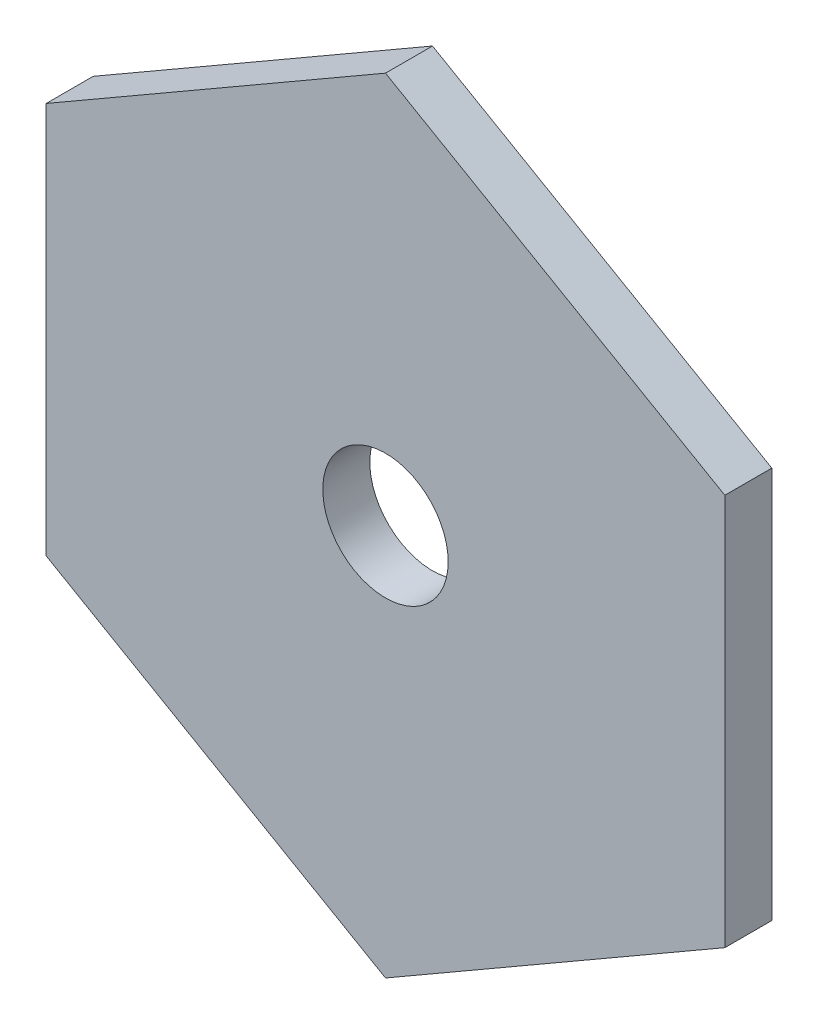
ISO-10303-21;
HEADER;
FILE_DESCRIPTION(('STEP AP214'),'2;1');
FILE_NAME('part.step','',(''),(''),'','','');
FILE_SCHEMA(('AUTOMOTIVE_DESIGN { 1 0 10303 214 1 1 1 1 }'));
ENDSEC;
DATA;
#1=APPLICATION_CONTEXT('core data for automotive mechanical design processes');
#2=APPLICATION_PROTOCOL_DEFINITION('international standard','automotive_design',2000,#1);
#3=PRODUCT_CONTEXT('',#1,'mechanical');
#4=PRODUCT('Part','Part','',(#3));
#5=PRODUCT_RELATED_PRODUCT_CATEGORY('part','',(#4));
#6=PRODUCT_DEFINITION_FORMATION('','',#4);
#7=PRODUCT_DEFINITION_CONTEXT('part definition',#1,'design');
#8=PRODUCT_DEFINITION('design','',#6,#7);
#9=PRODUCT_DEFINITION_SHAPE('','',#8);
#10=(LENGTH_UNIT() NAMED_UNIT(*) SI_UNIT(.MILLI.,.METRE.));
#11=(NAMED_UNIT(*) PLANE_ANGLE_UNIT() SI_UNIT($,.RADIAN.));
#12=(NAMED_UNIT(*) SI_UNIT($,.STERADIAN.) SOLID_ANGLE_UNIT());
#13=UNCERTAINTY_MEASURE_WITH_UNIT(LENGTH_MEASURE(1.E-05),#10,'distance_accuracy_value','');
#14=(GEOMETRIC_REPRESENTATION_CONTEXT(3) GLOBAL_UNCERTAINTY_ASSIGNED_CONTEXT((#13)) GLOBAL_UNIT_ASSIGNED_CONTEXT((#10,
#11,#12)) REPRESENTATION_CONTEXT('',''));
#15=CARTESIAN_POINT('',(0.,0.,0.));
#16=DIRECTION('',(0.,0.,1.));
#17=DIRECTION('',(1.,0.,0.));
#18=AXIS2_PLACEMENT_3D('',#15,#16,#17);
#19=CARTESIAN_POINT('',(21.6506350946108,12.5000000000003,3.));
#20=DIRECTION('',(-0.499999999999995,-0.866025403784441,0.));
#21=DIRECTION('',(0.866025403784442,-0.499999999999995,0.));
#22=AXIS2_PLACEMENT_3D('',#19,#20,#21);
#23=PLANE('',#22);
#24=DIRECTION('',(-0.866025403784442,0.499999999999995,0.));
#25=VECTOR('',#24,1.);
#26=CARTESIAN_POINT('',(21.6506350946108,12.5000000000003,0.));
#27=LINE('',#26,#25);
#28=CARTESIAN_POINT('',(21.6506350946108,12.5000000000003,0.));
#29=VERTEX_POINT('',#28);
#30=CARTESIAN_POINT('',(0.,25.,0.));
#31=VERTEX_POINT('',#30);
#32=EDGE_CURVE('E120',#29,#31,#27,.T.);
#33=ORIENTED_EDGE('',*,*,#32,.T.);
#34=DIRECTION('',(0.,0.,-1.));
#35=VECTOR('',#34,1.);
#36=CARTESIAN_POINT('',(0.,25.,3.));
#37=LINE('',#36,#35);
#38=CARTESIAN_POINT('',(0.,25.,3.));
#39=VERTEX_POINT('',#38);
#40=EDGE_CURVE('E11',#39,#31,#37,.T.);
#41=ORIENTED_EDGE('',*,*,#40,.F.);
#42=DIRECTION('',(-0.866025403784442,0.499999999999995,0.));
#43=VECTOR('',#42,1.);
#44=CARTESIAN_POINT('',(21.6506350946108,12.5000000000003,3.));
#45=LINE('',#44,#43);
#46=CARTESIAN_POINT('',(21.6506350946108,12.5000000000003,3.));
#47=VERTEX_POINT('',#46);
#48=EDGE_CURVE('E131',#47,#39,#45,.T.);
#49=ORIENTED_EDGE('',*,*,#48,.F.);
#50=DIRECTION('',(0.,0.,-1.));
#51=VECTOR('',#50,1.);
#52=CARTESIAN_POINT('',(21.6506350946108,12.5000000000003,3.));
#53=LINE('',#52,#51);
#54=EDGE_CURVE('E116',#47,#29,#53,.T.);
#55=ORIENTED_EDGE('',*,*,#54,.T.);
#56=EDGE_LOOP('',(#33,#41,#49,#55));
#57=FACE_BOUND('',#56,.T.);
#58=ADVANCED_FACE('F36',(#57),#23,.F.);
#59=CARTESIAN_POINT('',(0.,25.,3.));
#60=DIRECTION('',(0.500000000000001,-0.866025403784438,0.));
#61=DIRECTION('',(0.866025403784438,0.500000000000001,0.));
#62=AXIS2_PLACEMENT_3D('',#59,#60,#61);
#63=PLANE('',#62);
#64=DIRECTION('',(-0.866025403784438,-0.500000000000001,0.));
#65=VECTOR('',#64,1.);
#66=CARTESIAN_POINT('',(0.,25.,0.));
#67=LINE('',#66,#65);
#68=CARTESIAN_POINT('',(-21.650635094611,12.5,0.));
#69=VERTEX_POINT('',#68);
#70=EDGE_CURVE('E123',#31,#69,#67,.T.);
#71=ORIENTED_EDGE('',*,*,#70,.T.);
#72=DIRECTION('',(0.,0.,-1.));
#73=VECTOR('',#72,1.);
#74=CARTESIAN_POINT('',(-21.650635094611,12.5,3.));
#75=LINE('',#74,#73);
#76=CARTESIAN_POINT('',(-21.650635094611,12.5,3.));
#77=VERTEX_POINT('',#76);
#78=EDGE_CURVE('E44',#77,#69,#75,.T.);
#79=ORIENTED_EDGE('',*,*,#78,.F.);
#80=DIRECTION('',(-0.866025403784438,-0.500000000000001,0.));
#81=VECTOR('',#80,1.);
#82=CARTESIAN_POINT('',(0.,25.,3.));
#83=LINE('',#82,#81);
#84=EDGE_CURVE('E89',#39,#77,#83,.T.);
#85=ORIENTED_EDGE('',*,*,#84,.F.);
#86=ORIENTED_EDGE('',*,*,#40,.T.);
#87=EDGE_LOOP('',(#71,#79,#85,#86));
#88=FACE_BOUND('',#87,.T.);
#89=ADVANCED_FACE('F156',(#88),#63,.F.);
#90=CARTESIAN_POINT('',(-21.650635094611,12.5,3.));
#91=DIRECTION('',(1.,0.,0.));
#92=DIRECTION('',(0.,1.,0.));
#93=AXIS2_PLACEMENT_3D('',#90,#91,#92);
#94=PLANE('',#93);
#95=DIRECTION('',(0.,-1.,0.));
#96=VECTOR('',#95,1.);
#97=CARTESIAN_POINT('',(-21.650635094611,12.5,0.));
#98=LINE('',#97,#96);
#99=CARTESIAN_POINT('',(-21.6506350946109,-12.5000000000001,0.));
#100=VERTEX_POINT('',#99);
#101=EDGE_CURVE('E126',#69,#100,#98,.T.);
#102=ORIENTED_EDGE('',*,*,#101,.T.);
#103=DIRECTION('',(0.,0.,-1.));
#104=VECTOR('',#103,1.);
#105=CARTESIAN_POINT('',(-21.6506350946109,-12.5000000000001,3.));
#106=LINE('',#105,#104);
#107=CARTESIAN_POINT('',(-21.6506350946109,-12.5000000000001,3.));
#108=VERTEX_POINT('',#107);
#109=EDGE_CURVE('E111',#108,#100,#106,.T.);
#110=ORIENTED_EDGE('',*,*,#109,.F.);
#111=DIRECTION('',(0.,-1.,0.));
#112=VECTOR('',#111,1.);
#113=CARTESIAN_POINT('',(-21.650635094611,12.5,3.));
#114=LINE('',#113,#112);
#115=EDGE_CURVE('E102',#77,#108,#114,.T.);
#116=ORIENTED_EDGE('',*,*,#115,.F.);
#117=ORIENTED_EDGE('',*,*,#78,.T.);
#118=EDGE_LOOP('',(#102,#110,#116,#117));
#119=FACE_BOUND('',#118,.T.);
#120=ADVANCED_FACE('F137',(#119),#94,.F.);
#121=CARTESIAN_POINT('',(-21.6506350946109,-12.5000000000001,3.));
#122=DIRECTION('',(0.499999999999995,0.866025403784441,0.));
#123=DIRECTION('',(-0.866025403784442,0.499999999999995,0.));
#124=AXIS2_PLACEMENT_3D('',#121,#122,#123);
#125=PLANE('',#124);
#126=DIRECTION('',(0.866025403784442,-0.499999999999995,0.));
#127=VECTOR('',#126,1.);
#128=CARTESIAN_POINT('',(-21.6506350946109,-12.5000000000001,0.));
#129=LINE('',#128,#127);
#130=CARTESIAN_POINT('',(1.74574066942157E-13,-25.,0.));
#131=VERTEX_POINT('',#130);
#132=EDGE_CURVE('E110',#100,#131,#129,.T.);
#133=ORIENTED_EDGE('',*,*,#132,.T.);
#134=DIRECTION('',(0.,0.,-1.));
#135=VECTOR('',#134,1.);
#136=CARTESIAN_POINT('',(1.74574066942157E-13,-25.,3.));
#137=LINE('',#136,#135);
#138=CARTESIAN_POINT('',(1.74574066942157E-13,-25.,3.));
#139=VERTEX_POINT('',#138);
#140=EDGE_CURVE('E107',#139,#131,#137,.T.);
#141=ORIENTED_EDGE('',*,*,#140,.F.);
#142=DIRECTION('',(0.866025403784442,-0.499999999999995,0.));
#143=VECTOR('',#142,1.);
#144=CARTESIAN_POINT('',(-21.6506350946109,-12.5000000000001,3.));
#145=LINE('',#144,#143);
#146=EDGE_CURVE('E96',#108,#139,#145,.T.);
#147=ORIENTED_EDGE('',*,*,#146,.F.);
#148=ORIENTED_EDGE('',*,*,#109,.T.);
#149=EDGE_LOOP('',(#133,#141,#147,#148));
#150=FACE_BOUND('',#149,.T.);
#151=ADVANCED_FACE('F108',(#150),#125,.F.);
#152=CARTESIAN_POINT('',(1.74574066942157E-13,-25.,3.));
#153=DIRECTION('',(-0.500000000000007,0.866025403784434,0.));
#154=DIRECTION('',(-0.866025403784435,-0.500000000000007,0.));
#155=AXIS2_PLACEMENT_3D('',#152,#153,#154);
#156=PLANE('',#155);
#157=DIRECTION('',(0.866025403784435,0.500000000000007,0.));
#158=VECTOR('',#157,1.);
#159=CARTESIAN_POINT('',(1.74574066942157E-13,-25.,0.));
#160=LINE('',#159,#158);
#161=CARTESIAN_POINT('',(21.6506350946111,-12.4999999999998,0.));
#162=VERTEX_POINT('',#161);
#163=EDGE_CURVE('E75',#131,#162,#160,.T.);
#164=ORIENTED_EDGE('',*,*,#163,.T.);
#165=DIRECTION('',(0.,0.,-1.));
#166=VECTOR('',#165,1.);
#167=CARTESIAN_POINT('',(21.6506350946111,-12.4999999999998,3.));
#168=LINE('',#167,#166);
#169=CARTESIAN_POINT('',(21.6506350946111,-12.4999999999998,3.));
#170=VERTEX_POINT('',#169);
#171=EDGE_CURVE('E112',#170,#162,#168,.T.);
#172=ORIENTED_EDGE('',*,*,#171,.F.);
#173=DIRECTION('',(0.866025403784435,0.500000000000007,0.));
#174=VECTOR('',#173,1.);
#175=CARTESIAN_POINT('',(1.74574066942157E-13,-25.,3.));
#176=LINE('',#175,#174);
#177=EDGE_CURVE('E100',#139,#170,#176,.T.);
#178=ORIENTED_EDGE('',*,*,#177,.F.);
#179=ORIENTED_EDGE('',*,*,#140,.T.);
#180=EDGE_LOOP('',(#164,#172,#178,#179));
#181=FACE_BOUND('',#180,.T.);
#182=ADVANCED_FACE('F114',(#181),#156,.F.);
#183=CARTESIAN_POINT('',(21.6506350946111,-12.4999999999998,3.));
#184=DIRECTION('',(-1.,0.,0.));
#185=DIRECTION('',(0.,-1.,0.));
#186=AXIS2_PLACEMENT_3D('',#183,#184,#185);
#187=PLANE('',#186);
#188=DIRECTION('',(0.,1.,0.));
#189=VECTOR('',#188,1.);
#190=CARTESIAN_POINT('',(21.6506350946111,-12.4999999999998,0.));
#191=LINE('',#190,#189);
#192=EDGE_CURVE('E81',#162,#29,#191,.T.);
#193=ORIENTED_EDGE('',*,*,#192,.T.);
#194=ORIENTED_EDGE('',*,*,#54,.F.);
#195=DIRECTION('',(0.,1.,0.));
#196=VECTOR('',#195,1.);
#197=CARTESIAN_POINT('',(21.6506350946111,-12.4999999999998,3.));
#198=LINE('',#197,#196);
#199=EDGE_CURVE('E52',#170,#47,#198,.T.);
#200=ORIENTED_EDGE('',*,*,#199,.F.);
#201=ORIENTED_EDGE('',*,*,#171,.T.);
#202=EDGE_LOOP('',(#193,#194,#200,#201));
#203=FACE_BOUND('',#202,.T.);
#204=ADVANCED_FACE('F144',(#203),#187,.F.);
#205=CARTESIAN_POINT('',(0.,0.,3.));
#206=DIRECTION('',(0.,0.,1.));
#207=DIRECTION('',(1.,0.,0.));
#208=AXIS2_PLACEMENT_3D('',#205,#206,#207);
#209=PLANE('',#208);
#210=CARTESIAN_POINT('',(0.,0.,3.));
#211=DIRECTION('',(0.,0.,1.));
#212=DIRECTION('',(1.,0.,0.));
#213=AXIS2_PLACEMENT_3D('',#210,#211,#212);
#214=CIRCLE('',#213,4.);
#215=CARTESIAN_POINT('',(4.,0.,3.));
#216=VERTEX_POINT('',#215);
#217=EDGE_CURVE('E211',#216,#216,#214,.T.);
#218=ORIENTED_EDGE('',*,*,#217,.F.);
#219=EDGE_LOOP('',(#218));
#220=FACE_BOUND('',#219,.T.);
#221=ORIENTED_EDGE('',*,*,#48,.T.);
#222=ORIENTED_EDGE('',*,*,#84,.T.);
#223=ORIENTED_EDGE('',*,*,#115,.T.);
#224=ORIENTED_EDGE('',*,*,#146,.T.);
#225=ORIENTED_EDGE('',*,*,#177,.T.);
#226=ORIENTED_EDGE('',*,*,#199,.T.);
#227=EDGE_LOOP('',(#221,#222,#223,#224,#225,#226));
#228=FACE_BOUND('',#227,.T.);
#229=ADVANCED_FACE('F98',(#220,#228),#209,.T.);
#230=CARTESIAN_POINT('',(0.,0.,0.));
#231=DIRECTION('',(0.,0.,1.));
#232=DIRECTION('',(1.,0.,0.));
#233=AXIS2_PLACEMENT_3D('',#230,#231,#232);
#234=PLANE('',#233);
#235=CARTESIAN_POINT('',(0.,0.,0.));
#236=DIRECTION('',(0.,0.,1.));
#237=DIRECTION('',(1.,0.,0.));
#238=AXIS2_PLACEMENT_3D('',#235,#236,#237);
#239=CIRCLE('',#238,4.);
#240=CARTESIAN_POINT('',(4.,0.,0.));
#241=VERTEX_POINT('',#240);
#242=EDGE_CURVE('E124',#241,#241,#239,.T.);
#243=ORIENTED_EDGE('',*,*,#242,.T.);
#244=EDGE_LOOP('',(#243));
#245=FACE_BOUND('',#244,.T.);
#246=ORIENTED_EDGE('',*,*,#32,.F.);
#247=ORIENTED_EDGE('',*,*,#192,.F.);
#248=ORIENTED_EDGE('',*,*,#163,.F.);
#249=ORIENTED_EDGE('',*,*,#132,.F.);
#250=ORIENTED_EDGE('',*,*,#101,.F.);
#251=ORIENTED_EDGE('',*,*,#70,.F.);
#252=EDGE_LOOP('',(#246,#247,#248,#249,#250,#251));
#253=FACE_BOUND('',#252,.T.);
#254=ADVANCED_FACE('F140',(#245,#253),#234,.F.);
#255=CARTESIAN_POINT('',(0.,0.,0.));
#256=DIRECTION('',(0.,0.,1.));
#257=DIRECTION('',(1.,0.,0.));
#258=AXIS2_PLACEMENT_3D('',#255,#256,#257);
#259=CYLINDRICAL_SURFACE('',#258,4.);
#260=ORIENTED_EDGE('',*,*,#242,.F.);
#261=EDGE_LOOP('',(#260));
#262=FACE_BOUND('',#261,.T.);
#263=ORIENTED_EDGE('',*,*,#217,.T.);
#264=EDGE_LOOP('',(#263));
#265=FACE_BOUND('',#264,.T.);
#266=ADVANCED_FACE('F193',(#262,#265),#259,.F.);
#267=CLOSED_SHELL('',(#58,#89,#120,#151,#182,#204,#229,#254,#266));
#268=MANIFOLD_SOLID_BREP('B2',#267);
#269=ADVANCED_BREP_SHAPE_REPRESENTATION('',(#18,#268),#14);
#270=SHAPE_DEFINITION_REPRESENTATION(#9,#269);
ENDSEC;
END-ISO-10303-21;
